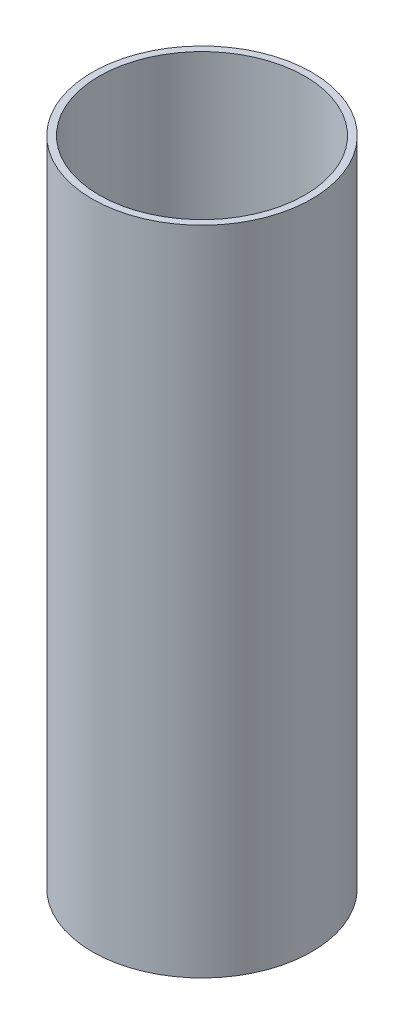
ISO-10303-21;
HEADER;
FILE_DESCRIPTION(('STEP AP214'),'2;1');
FILE_NAME('part.step','',(''),(''),'','','');
FILE_SCHEMA(('AUTOMOTIVE_DESIGN { 1 0 10303 214 1 1 1 1 }'));
ENDSEC;
DATA;
#1=APPLICATION_CONTEXT('core data for automotive mechanical design processes');
#2=APPLICATION_PROTOCOL_DEFINITION('international standard','automotive_design',2000,#1);
#3=PRODUCT_CONTEXT('',#1,'mechanical');
#4=PRODUCT('Part','Part','',(#3));
#5=PRODUCT_RELATED_PRODUCT_CATEGORY('part','',(#4));
#6=PRODUCT_DEFINITION_FORMATION('','',#4);
#7=PRODUCT_DEFINITION_CONTEXT('part definition',#1,'design');
#8=PRODUCT_DEFINITION('design','',#6,#7);
#9=PRODUCT_DEFINITION_SHAPE('','',#8);
#10=(LENGTH_UNIT() NAMED_UNIT(*) SI_UNIT(.MILLI.,.METRE.));
#11=(NAMED_UNIT(*) PLANE_ANGLE_UNIT() SI_UNIT($,.RADIAN.));
#12=(NAMED_UNIT(*) SI_UNIT($,.STERADIAN.) SOLID_ANGLE_UNIT());
#13=UNCERTAINTY_MEASURE_WITH_UNIT(LENGTH_MEASURE(1.E-05),#10,'distance_accuracy_value','');
#14=(GEOMETRIC_REPRESENTATION_CONTEXT(3) GLOBAL_UNCERTAINTY_ASSIGNED_CONTEXT((#13)) GLOBAL_UNIT_ASSIGNED_CONTEXT((#10,
#11,#12)) REPRESENTATION_CONTEXT('',''));
#15=CARTESIAN_POINT('',(0.,0.,0.));
#16=DIRECTION('',(0.,0.,1.));
#17=DIRECTION('',(1.,0.,0.));
#18=AXIS2_PLACEMENT_3D('',#15,#16,#17);
#19=CARTESIAN_POINT('',(0.,85.,0.));
#20=DIRECTION('',(0.,1.,0.));
#21=DIRECTION('',(0.,0.,1.));
#22=AXIS2_PLACEMENT_3D('',#19,#20,#21);
#23=PLANE('',#22);
#24=CARTESIAN_POINT('',(0.,85.,0.));
#25=DIRECTION('',(0.,1.,0.));
#26=DIRECTION('',(0.,0.,1.));
#27=AXIS2_PLACEMENT_3D('',#24,#25,#26);
#28=CIRCLE('',#27,16.);
#29=CARTESIAN_POINT('',(0.,85.,16.));
#30=VERTEX_POINT('',#29);
#31=EDGE_CURVE('E10',#30,#30,#28,.T.);
#32=ORIENTED_EDGE('',*,*,#31,.T.);
#33=EDGE_LOOP('',(#32));
#34=FACE_BOUND('',#33,.T.);
#35=CARTESIAN_POINT('',(0.,85.,0.));
#36=DIRECTION('',(0.,1.,0.));
#37=DIRECTION('',(0.,0.,1.));
#38=AXIS2_PLACEMENT_3D('',#35,#36,#37);
#39=CIRCLE('',#38,15.);
#40=CARTESIAN_POINT('',(0.,85.,15.));
#41=VERTEX_POINT('',#40);
#42=EDGE_CURVE('E40',#41,#41,#39,.T.);
#43=ORIENTED_EDGE('',*,*,#42,.F.);
#44=EDGE_LOOP('',(#43));
#45=FACE_BOUND('',#44,.T.);
#46=ADVANCED_FACE('F33',(#34,#45),#23,.T.);
#47=CARTESIAN_POINT('',(0.,85.,0.));
#48=DIRECTION('',(0.,-1.,0.));
#49=DIRECTION('',(0.,0.,-1.));
#50=AXIS2_PLACEMENT_3D('',#47,#48,#49);
#51=CYLINDRICAL_SURFACE('',#50,16.);
#52=ORIENTED_EDGE('',*,*,#31,.F.);
#53=EDGE_LOOP('',(#52));
#54=FACE_BOUND('',#53,.T.);
#55=CARTESIAN_POINT('',(0.,-10.,0.));
#56=DIRECTION('',(0.,1.,0.));
#57=DIRECTION('',(0.,0.,1.));
#58=AXIS2_PLACEMENT_3D('',#55,#56,#57);
#59=CIRCLE('',#58,16.);
#60=CARTESIAN_POINT('',(0.,-10.,16.));
#61=VERTEX_POINT('',#60);
#62=EDGE_CURVE('E44',#61,#61,#59,.T.);
#63=ORIENTED_EDGE('',*,*,#62,.T.);
#64=EDGE_LOOP('',(#63));
#65=FACE_BOUND('',#64,.T.);
#66=ADVANCED_FACE('F35',(#54,#65),#51,.T.);
#67=CARTESIAN_POINT('',(0.,85.,0.));
#68=DIRECTION('',(0.,-1.,0.));
#69=DIRECTION('',(0.,0.,-1.));
#70=AXIS2_PLACEMENT_3D('',#67,#68,#69);
#71=CYLINDRICAL_SURFACE('',#70,15.);
#72=ORIENTED_EDGE('',*,*,#42,.T.);
#73=EDGE_LOOP('',(#72));
#74=FACE_BOUND('',#73,.T.);
#75=CARTESIAN_POINT('',(0.,-10.,0.));
#76=DIRECTION('',(0.,1.,0.));
#77=DIRECTION('',(0.,0.,1.));
#78=AXIS2_PLACEMENT_3D('',#75,#76,#77);
#79=CIRCLE('',#78,15.);
#80=CARTESIAN_POINT('',(0.,-10.,15.));
#81=VERTEX_POINT('',#80);
#82=EDGE_CURVE('E48',#81,#81,#79,.T.);
#83=ORIENTED_EDGE('',*,*,#82,.F.);
#84=EDGE_LOOP('',(#83));
#85=FACE_BOUND('',#84,.T.);
#86=ADVANCED_FACE('F57',(#74,#85),#71,.F.);
#87=CARTESIAN_POINT('',(0.,-10.,0.));
#88=DIRECTION('',(0.,1.,0.));
#89=DIRECTION('',(0.,0.,1.));
#90=AXIS2_PLACEMENT_3D('',#87,#88,#89);
#91=PLANE('',#90);
#92=ORIENTED_EDGE('',*,*,#82,.T.);
#93=EDGE_LOOP('',(#92));
#94=FACE_BOUND('',#93,.T.);
#95=ORIENTED_EDGE('',*,*,#62,.F.);
#96=EDGE_LOOP('',(#95));
#97=FACE_BOUND('',#96,.T.);
#98=ADVANCED_FACE('F54',(#94,#97),#91,.F.);
#99=CLOSED_SHELL('',(#46,#66,#86,#98));
#100=MANIFOLD_SOLID_BREP('B2',#99);
#101=ADVANCED_BREP_SHAPE_REPRESENTATION('',(#18,#100),#14);
#102=SHAPE_DEFINITION_REPRESENTATION(#9,#101);
ENDSEC;
END-ISO-10303-21;
